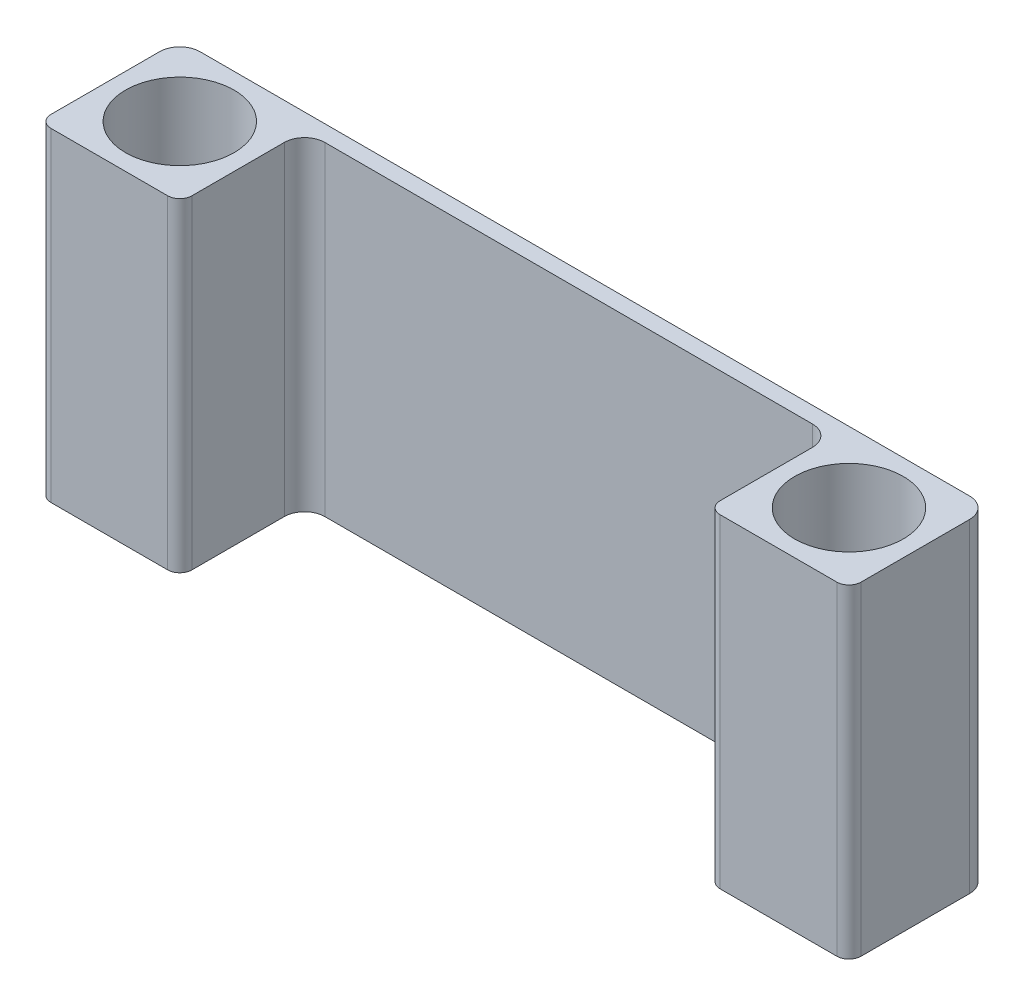
ISO-10303-21;
HEADER;
FILE_DESCRIPTION(('STEP AP214'),'2;1');
FILE_NAME('part.step','',(''),(''),'','','');
FILE_SCHEMA(('AUTOMOTIVE_DESIGN { 1 0 10303 214 1 1 1 1 }'));
ENDSEC;
DATA;
#1=APPLICATION_CONTEXT('core data for automotive mechanical design processes');
#2=APPLICATION_PROTOCOL_DEFINITION('international standard','automotive_design',2000,#1);
#3=PRODUCT_CONTEXT('',#1,'mechanical');
#4=PRODUCT('Part','Part','',(#3));
#5=PRODUCT_RELATED_PRODUCT_CATEGORY('part','',(#4));
#6=PRODUCT_DEFINITION_FORMATION('','',#4);
#7=PRODUCT_DEFINITION_CONTEXT('part definition',#1,'design');
#8=PRODUCT_DEFINITION('design','',#6,#7);
#9=PRODUCT_DEFINITION_SHAPE('','',#8);
#10=(LENGTH_UNIT() NAMED_UNIT(*) SI_UNIT(.MILLI.,.METRE.));
#11=(NAMED_UNIT(*) PLANE_ANGLE_UNIT() SI_UNIT($,.RADIAN.));
#12=(NAMED_UNIT(*) SI_UNIT($,.STERADIAN.) SOLID_ANGLE_UNIT());
#13=UNCERTAINTY_MEASURE_WITH_UNIT(LENGTH_MEASURE(1.E-05),#10,'distance_accuracy_value','');
#14=(GEOMETRIC_REPRESENTATION_CONTEXT(3) GLOBAL_UNCERTAINTY_ASSIGNED_CONTEXT((#13)) GLOBAL_UNIT_ASSIGNED_CONTEXT((#10,
#11,#12)) REPRESENTATION_CONTEXT('',''));
#15=CARTESIAN_POINT('',(0.,0.,0.));
#16=DIRECTION('',(0.,0.,1.));
#17=DIRECTION('',(1.,0.,0.));
#18=AXIS2_PLACEMENT_3D('',#15,#16,#17);
#19=CARTESIAN_POINT('',(0.,80.,-17.4));
#20=DIRECTION('',(0.,0.,-1.));
#21=DIRECTION('',(-1.,0.,0.));
#22=AXIS2_PLACEMENT_3D('',#19,#20,#21);
#23=PLANE('',#22);
#24=DIRECTION('',(1.,0.,0.));
#25=VECTOR('',#24,1.);
#26=CARTESIAN_POINT('',(0.,80.,-17.4));
#27=LINE('',#26,#25);
#28=CARTESIAN_POINT('',(-12.4,80.,-17.4));
#29=VERTEX_POINT('',#28);
#30=CARTESIAN_POINT('',(177.6,80.,-17.4));
#31=VERTEX_POINT('',#30);
#32=EDGE_CURVE('E183',#29,#31,#27,.T.);
#33=ORIENTED_EDGE('',*,*,#32,.T.);
#34=DIRECTION('',(0.,-1.,0.));
#35=VECTOR('',#34,1.);
#36=CARTESIAN_POINT('',(177.6,80.,-17.4));
#37=LINE('',#36,#35);
#38=CARTESIAN_POINT('',(177.6,0.,-17.4));
#39=VERTEX_POINT('',#38);
#40=EDGE_CURVE('E196',#31,#39,#37,.T.);
#41=ORIENTED_EDGE('',*,*,#40,.T.);
#42=DIRECTION('',(1.,0.,0.));
#43=VECTOR('',#42,1.);
#44=CARTESIAN_POINT('',(0.,0.,-17.4));
#45=LINE('',#44,#43);
#46=CARTESIAN_POINT('',(-12.4,0.,-17.4));
#47=VERTEX_POINT('',#46);
#48=EDGE_CURVE('E268',#47,#39,#45,.T.);
#49=ORIENTED_EDGE('',*,*,#48,.F.);
#50=DIRECTION('',(0.,-1.,0.));
#51=VECTOR('',#50,1.);
#52=CARTESIAN_POINT('',(-12.4,80.,-17.4));
#53=LINE('',#52,#51);
#54=EDGE_CURVE('E194',#47,#29,#53,.F.);
#55=ORIENTED_EDGE('',*,*,#54,.T.);
#56=EDGE_LOOP('',(#33,#41,#49,#55));
#57=FACE_BOUND('',#56,.T.);
#58=ADVANCED_FACE('F35',(#57),#23,.T.);
#59=CARTESIAN_POINT('',(-17.4,80.,0.));
#60=DIRECTION('',(1.,0.,0.));
#61=DIRECTION('',(0.,0.,-1.));
#62=AXIS2_PLACEMENT_3D('',#59,#60,#61);
#63=PLANE('',#62);
#64=DIRECTION('',(0.,0.,1.));
#65=VECTOR('',#64,1.);
#66=CARTESIAN_POINT('',(-17.4,0.,0.));
#67=LINE('',#66,#65);
#68=CARTESIAN_POINT('',(-17.4,0.,-12.4));
#69=VERTEX_POINT('',#68);
#70=CARTESIAN_POINT('',(-17.4,0.,14.4));
#71=VERTEX_POINT('',#70);
#72=EDGE_CURVE('E267',#69,#71,#67,.T.);
#73=ORIENTED_EDGE('',*,*,#72,.T.);
#74=DIRECTION('',(0.,-1.,0.));
#75=VECTOR('',#74,1.);
#76=CARTESIAN_POINT('',(-17.4,80.,14.4));
#77=LINE('',#76,#75);
#78=CARTESIAN_POINT('',(-17.4,80.,14.4));
#79=VERTEX_POINT('',#78);
#80=EDGE_CURVE('E11',#71,#79,#77,.F.);
#81=ORIENTED_EDGE('',*,*,#80,.T.);
#82=DIRECTION('',(0.,0.,1.));
#83=VECTOR('',#82,1.);
#84=CARTESIAN_POINT('',(-17.4,80.,0.));
#85=LINE('',#84,#83);
#86=CARTESIAN_POINT('',(-17.4,80.,-12.4));
#87=VERTEX_POINT('',#86);
#88=EDGE_CURVE('E259',#87,#79,#85,.T.);
#89=ORIENTED_EDGE('',*,*,#88,.F.);
#90=DIRECTION('',(0.,-1.,0.));
#91=VECTOR('',#90,1.);
#92=CARTESIAN_POINT('',(-17.4,0.,-12.4));
#93=LINE('',#92,#91);
#94=EDGE_CURVE('E162',#87,#69,#93,.T.);
#95=ORIENTED_EDGE('',*,*,#94,.T.);
#96=EDGE_LOOP('',(#73,#81,#89,#95));
#97=FACE_BOUND('',#96,.T.);
#98=ADVANCED_FACE('F323',(#97),#63,.F.);
#99=CARTESIAN_POINT('',(0.,80.,17.4));
#100=DIRECTION('',(0.,0.,-1.));
#101=DIRECTION('',(-1.,0.,0.));
#102=AXIS2_PLACEMENT_3D('',#99,#100,#101);
#103=PLANE('',#102);
#104=DIRECTION('',(1.,0.,0.));
#105=VECTOR('',#104,1.);
#106=CARTESIAN_POINT('',(0.,0.,17.4));
#107=LINE('',#106,#105);
#108=CARTESIAN_POINT('',(-14.4,0.,17.4));
#109=VERTEX_POINT('',#108);
#110=CARTESIAN_POINT('',(14.4,0.,17.4));
#111=VERTEX_POINT('',#110);
#112=EDGE_CURVE('E185',#109,#111,#107,.T.);
#113=ORIENTED_EDGE('',*,*,#112,.T.);
#114=DIRECTION('',(0.,-1.,0.));
#115=VECTOR('',#114,1.);
#116=CARTESIAN_POINT('',(14.4,80.,17.4));
#117=LINE('',#116,#115);
#118=CARTESIAN_POINT('',(14.4,80.,17.4));
#119=VERTEX_POINT('',#118);
#120=EDGE_CURVE('E43',#111,#119,#117,.F.);
#121=ORIENTED_EDGE('',*,*,#120,.T.);
#122=DIRECTION('',(1.,0.,0.));
#123=VECTOR('',#122,1.);
#124=CARTESIAN_POINT('',(0.,80.,17.4));
#125=LINE('',#124,#123);
#126=CARTESIAN_POINT('',(-14.4,80.,17.4));
#127=VERTEX_POINT('',#126);
#128=EDGE_CURVE('E249',#127,#119,#125,.T.);
#129=ORIENTED_EDGE('',*,*,#128,.F.);
#130=DIRECTION('',(0.,-1.,0.));
#131=VECTOR('',#130,1.);
#132=CARTESIAN_POINT('',(-14.4,80.,17.4));
#133=LINE('',#132,#131);
#134=EDGE_CURVE('E242',#127,#109,#133,.T.);
#135=ORIENTED_EDGE('',*,*,#134,.T.);
#136=EDGE_LOOP('',(#113,#121,#129,#135));
#137=FACE_BOUND('',#136,.T.);
#138=ADVANCED_FACE('F248',(#137),#103,.F.);
#139=CARTESIAN_POINT('',(17.4,80.,0.));
#140=DIRECTION('',(1.,0.,0.));
#141=DIRECTION('',(0.,0.,-1.));
#142=AXIS2_PLACEMENT_3D('',#139,#140,#141);
#143=PLANE('',#142);
#144=DIRECTION('',(0.,0.,1.));
#145=VECTOR('',#144,1.);
#146=CARTESIAN_POINT('',(17.4,80.,0.));
#147=LINE('',#146,#145);
#148=CARTESIAN_POINT('',(17.4,80.,-8.39999999999998));
#149=VERTEX_POINT('',#148);
#150=CARTESIAN_POINT('',(17.4,80.,14.4));
#151=VERTEX_POINT('',#150);
#152=EDGE_CURVE('E258',#149,#151,#147,.T.);
#153=ORIENTED_EDGE('',*,*,#152,.T.);
#154=DIRECTION('',(0.,-1.,0.));
#155=VECTOR('',#154,1.);
#156=CARTESIAN_POINT('',(17.4,0.,14.4));
#157=LINE('',#156,#155);
#158=CARTESIAN_POINT('',(17.4,0.,14.4));
#159=VERTEX_POINT('',#158);
#160=EDGE_CURVE('E239',#151,#159,#157,.T.);
#161=ORIENTED_EDGE('',*,*,#160,.T.);
#162=DIRECTION('',(0.,0.,1.));
#163=VECTOR('',#162,1.);
#164=CARTESIAN_POINT('',(17.4,0.,0.));
#165=LINE('',#164,#163);
#166=CARTESIAN_POINT('',(17.4,0.,-8.39999999999998));
#167=VERTEX_POINT('',#166);
#168=EDGE_CURVE('E180',#167,#159,#165,.T.);
#169=ORIENTED_EDGE('',*,*,#168,.F.);
#170=DIRECTION('',(0.,-1.,0.));
#171=VECTOR('',#170,1.);
#172=CARTESIAN_POINT('',(17.4,80.,-8.39999999999998));
#173=LINE('',#172,#171);
#174=EDGE_CURVE('E156',#167,#149,#173,.F.);
#175=ORIENTED_EDGE('',*,*,#174,.T.);
#176=EDGE_LOOP('',(#153,#161,#169,#175));
#177=FACE_BOUND('',#176,.T.);
#178=ADVANCED_FACE('F264',(#177),#143,.T.);
#179=CARTESIAN_POINT('',(0.,80.,0.));
#180=DIRECTION('',(0.,-1.,0.));
#181=DIRECTION('',(0.,0.,-1.));
#182=AXIS2_PLACEMENT_3D('',#179,#180,#181);
#183=CYLINDRICAL_SURFACE('',#182,13.4);
#184=CARTESIAN_POINT('',(0.,80.,0.));
#185=DIRECTION('',(0.,1.,0.));
#186=DIRECTION('',(0.,0.,1.));
#187=AXIS2_PLACEMENT_3D('',#184,#185,#186);
#188=CIRCLE('',#187,13.4);
#189=CARTESIAN_POINT('',(0.,80.,13.4));
#190=VERTEX_POINT('',#189);
#191=EDGE_CURVE('E179',#190,#190,#188,.T.);
#192=ORIENTED_EDGE('',*,*,#191,.T.);
#193=EDGE_LOOP('',(#192));
#194=FACE_BOUND('',#193,.T.);
#195=CARTESIAN_POINT('',(0.,0.,0.));
#196=DIRECTION('',(0.,1.,0.));
#197=DIRECTION('',(0.,0.,1.));
#198=AXIS2_PLACEMENT_3D('',#195,#196,#197);
#199=CIRCLE('',#198,13.4);
#200=CARTESIAN_POINT('',(0.,0.,13.4));
#201=VERTEX_POINT('',#200);
#202=EDGE_CURVE('E273',#201,#201,#199,.T.);
#203=ORIENTED_EDGE('',*,*,#202,.F.);
#204=EDGE_LOOP('',(#203));
#205=FACE_BOUND('',#204,.T.);
#206=ADVANCED_FACE('F333',(#194,#205),#183,.F.);
#207=CARTESIAN_POINT('',(0.,80.,-13.4));
#208=DIRECTION('',(0.,0.,-1.));
#209=DIRECTION('',(-1.,0.,0.));
#210=AXIS2_PLACEMENT_3D('',#207,#208,#209);
#211=PLANE('',#210);
#212=DIRECTION('',(1.,0.,0.));
#213=VECTOR('',#212,1.);
#214=CARTESIAN_POINT('',(0.,80.,-13.4));
#215=LINE('',#214,#213);
#216=CARTESIAN_POINT('',(22.4,80.,-13.4));
#217=VERTEX_POINT('',#216);
#218=CARTESIAN_POINT('',(142.8,80.,-13.4));
#219=VERTEX_POINT('',#218);
#220=EDGE_CURVE('E171',#217,#219,#215,.T.);
#221=ORIENTED_EDGE('',*,*,#220,.F.);
#222=DIRECTION('',(0.,-1.,0.));
#223=VECTOR('',#222,1.);
#224=CARTESIAN_POINT('',(22.4,80.,-13.4));
#225=LINE('',#224,#223);
#226=CARTESIAN_POINT('',(22.4,0.,-13.4));
#227=VERTEX_POINT('',#226);
#228=EDGE_CURVE('E155',#217,#227,#225,.T.);
#229=ORIENTED_EDGE('',*,*,#228,.T.);
#230=DIRECTION('',(1.,0.,0.));
#231=VECTOR('',#230,1.);
#232=CARTESIAN_POINT('',(0.,0.,-13.4));
#233=LINE('',#232,#231);
#234=CARTESIAN_POINT('',(142.8,0.,-13.4));
#235=VERTEX_POINT('',#234);
#236=EDGE_CURVE('E168',#227,#235,#233,.T.);
#237=ORIENTED_EDGE('',*,*,#236,.T.);
#238=DIRECTION('',(0.,-1.,0.));
#239=VECTOR('',#238,1.);
#240=CARTESIAN_POINT('',(142.8,80.,-13.4));
#241=LINE('',#240,#239);
#242=EDGE_CURVE('E172',#235,#219,#241,.F.);
#243=ORIENTED_EDGE('',*,*,#242,.T.);
#244=EDGE_LOOP('',(#221,#229,#237,#243));
#245=FACE_BOUND('',#244,.T.);
#246=ADVANCED_FACE('F167',(#245),#211,.F.);
#247=CARTESIAN_POINT('',(0.,80.,0.));
#248=DIRECTION('',(0.,1.,0.));
#249=DIRECTION('',(0.,0.,1.));
#250=AXIS2_PLACEMENT_3D('',#247,#248,#249);
#251=PLANE('',#250);
#252=ORIENTED_EDGE('',*,*,#191,.F.);
#253=EDGE_LOOP('',(#252));
#254=FACE_BOUND('',#253,.T.);
#255=DIRECTION('',(-1.,0.,0.));
#256=VECTOR('',#255,1.);
#257=CARTESIAN_POINT('',(165.2,80.,17.4));
#258=LINE('',#257,#256);
#259=CARTESIAN_POINT('',(179.6,80.,17.4));
#260=VERTEX_POINT('',#259);
#261=CARTESIAN_POINT('',(150.8,80.,17.4));
#262=VERTEX_POINT('',#261);
#263=EDGE_CURVE('E295',#260,#262,#258,.T.);
#264=ORIENTED_EDGE('',*,*,#263,.F.);
#265=CARTESIAN_POINT('',(179.6,80.,14.4));
#266=DIRECTION('',(0.,1.,0.));
#267=DIRECTION('',(0.,0.,1.));
#268=AXIS2_PLACEMENT_3D('',#265,#266,#267);
#269=CIRCLE('',#268,3.);
#270=CARTESIAN_POINT('',(182.6,80.,14.4));
#271=VERTEX_POINT('',#270);
#272=EDGE_CURVE('E236',#260,#271,#269,.T.);
#273=ORIENTED_EDGE('',*,*,#272,.T.);
#274=DIRECTION('',(0.,0.,1.));
#275=VECTOR('',#274,1.);
#276=CARTESIAN_POINT('',(182.6,80.,0.));
#277=LINE('',#276,#275);
#278=CARTESIAN_POINT('',(182.6,80.,-12.4));
#279=VERTEX_POINT('',#278);
#280=EDGE_CURVE('E276',#279,#271,#277,.T.);
#281=ORIENTED_EDGE('',*,*,#280,.F.);
#282=CARTESIAN_POINT('',(177.6,80.,-12.4));
#283=DIRECTION('',(0.,1.,0.));
#284=DIRECTION('',(0.,0.,1.));
#285=AXIS2_PLACEMENT_3D('',#282,#283,#284);
#286=CIRCLE('',#285,5.);
#287=EDGE_CURVE('E207',#279,#31,#286,.T.);
#288=ORIENTED_EDGE('',*,*,#287,.T.);
#289=ORIENTED_EDGE('',*,*,#32,.F.);
#290=CARTESIAN_POINT('',(-12.4,80.,-12.4));
#291=DIRECTION('',(0.,1.,0.));
#292=DIRECTION('',(0.,0.,1.));
#293=AXIS2_PLACEMENT_3D('',#290,#291,#292);
#294=CIRCLE('',#293,5.);
#295=EDGE_CURVE('E205',#29,#87,#294,.T.);
#296=ORIENTED_EDGE('',*,*,#295,.T.);
#297=ORIENTED_EDGE('',*,*,#88,.T.);
#298=CARTESIAN_POINT('',(-14.4,80.,14.4));
#299=DIRECTION('',(0.,1.,0.));
#300=DIRECTION('',(0.,0.,1.));
#301=AXIS2_PLACEMENT_3D('',#298,#299,#300);
#302=CIRCLE('',#301,3.);
#303=EDGE_CURVE('E231',#79,#127,#302,.T.);
#304=ORIENTED_EDGE('',*,*,#303,.T.);
#305=ORIENTED_EDGE('',*,*,#128,.T.);
#306=CARTESIAN_POINT('',(14.4,80.,14.4));
#307=DIRECTION('',(0.,1.,0.));
#308=DIRECTION('',(0.,0.,1.));
#309=AXIS2_PLACEMENT_3D('',#306,#307,#308);
#310=CIRCLE('',#309,3.);
#311=EDGE_CURVE('E58',#119,#151,#310,.T.);
#312=ORIENTED_EDGE('',*,*,#311,.T.);
#313=ORIENTED_EDGE('',*,*,#152,.F.);
#314=CARTESIAN_POINT('',(22.4,80.,-8.39999999999998));
#315=DIRECTION('',(0.,1.,0.));
#316=DIRECTION('',(0.,0.,1.));
#317=AXIS2_PLACEMENT_3D('',#314,#315,#316);
#318=CIRCLE('',#317,5.);
#319=EDGE_CURVE('E161',#149,#217,#318,.F.);
#320=ORIENTED_EDGE('',*,*,#319,.T.);
#321=ORIENTED_EDGE('',*,*,#220,.T.);
#322=CARTESIAN_POINT('',(142.8,80.,-8.39999999999998));
#323=DIRECTION('',(0.,1.,0.));
#324=DIRECTION('',(0.,0.,1.));
#325=AXIS2_PLACEMENT_3D('',#322,#323,#324);
#326=CIRCLE('',#325,5.);
#327=CARTESIAN_POINT('',(147.8,80.,-8.39999999999998));
#328=VERTEX_POINT('',#327);
#329=EDGE_CURVE('E213',#219,#328,#326,.F.);
#330=ORIENTED_EDGE('',*,*,#329,.T.);
#331=DIRECTION('',(0.,0.,1.));
#332=VECTOR('',#331,1.);
#333=CARTESIAN_POINT('',(147.8,80.,0.));
#334=LINE('',#333,#332);
#335=CARTESIAN_POINT('',(147.8,80.,14.4));
#336=VERTEX_POINT('',#335);
#337=EDGE_CURVE('E298',#328,#336,#334,.T.);
#338=ORIENTED_EDGE('',*,*,#337,.T.);
#339=CARTESIAN_POINT('',(150.8,80.,14.4));
#340=DIRECTION('',(0.,1.,0.));
#341=DIRECTION('',(0.,0.,1.));
#342=AXIS2_PLACEMENT_3D('',#339,#340,#341);
#343=CIRCLE('',#342,3.);
#344=EDGE_CURVE('E234',#336,#262,#343,.T.);
#345=ORIENTED_EDGE('',*,*,#344,.T.);
#346=EDGE_LOOP('',(#264,#273,#281,#288,#289,#296,#297,#304,#305,#312,#313,#320,#321,#330,#338,#345));
#347=FACE_BOUND('',#346,.T.);
#348=CARTESIAN_POINT('',(165.2,80.,0.));
#349=DIRECTION('',(0.,-1.,0.));
#350=DIRECTION('',(0.,0.,1.));
#351=AXIS2_PLACEMENT_3D('',#348,#349,#350);
#352=CIRCLE('',#351,13.4);
#353=CARTESIAN_POINT('',(165.2,80.,13.4));
#354=VERTEX_POINT('',#353);
#355=EDGE_CURVE('E284',#354,#354,#352,.T.);
#356=ORIENTED_EDGE('',*,*,#355,.T.);
#357=EDGE_LOOP('',(#356));
#358=FACE_BOUND('',#357,.T.);
#359=ADVANCED_FACE('F254',(#254,#347,#358),#251,.T.);
#360=CARTESIAN_POINT('',(0.,0.,0.));
#361=DIRECTION('',(0.,1.,0.));
#362=DIRECTION('',(0.,0.,1.));
#363=AXIS2_PLACEMENT_3D('',#360,#361,#362);
#364=PLANE('',#363);
#365=ORIENTED_EDGE('',*,*,#202,.T.);
#366=EDGE_LOOP('',(#365));
#367=FACE_BOUND('',#366,.T.);
#368=DIRECTION('',(0.,0.,1.));
#369=VECTOR('',#368,1.);
#370=CARTESIAN_POINT('',(182.6,0.,0.));
#371=LINE('',#370,#369);
#372=CARTESIAN_POINT('',(182.6,0.,-12.4));
#373=VERTEX_POINT('',#372);
#374=CARTESIAN_POINT('',(182.6,0.,14.4));
#375=VERTEX_POINT('',#374);
#376=EDGE_CURVE('E282',#373,#375,#371,.T.);
#377=ORIENTED_EDGE('',*,*,#376,.T.);
#378=CARTESIAN_POINT('',(179.6,0.,14.4));
#379=DIRECTION('',(0.,1.,0.));
#380=DIRECTION('',(0.,0.,1.));
#381=AXIS2_PLACEMENT_3D('',#378,#379,#380);
#382=CIRCLE('',#381,3.);
#383=CARTESIAN_POINT('',(179.6,0.,17.4));
#384=VERTEX_POINT('',#383);
#385=EDGE_CURVE('E224',#375,#384,#382,.F.);
#386=ORIENTED_EDGE('',*,*,#385,.T.);
#387=DIRECTION('',(-1.,0.,0.));
#388=VECTOR('',#387,1.);
#389=CARTESIAN_POINT('',(165.2,0.,17.4));
#390=LINE('',#389,#388);
#391=CARTESIAN_POINT('',(150.8,0.,17.4));
#392=VERTEX_POINT('',#391);
#393=EDGE_CURVE('E285',#384,#392,#390,.T.);
#394=ORIENTED_EDGE('',*,*,#393,.T.);
#395=CARTESIAN_POINT('',(150.8,0.,14.4));
#396=DIRECTION('',(0.,1.,0.));
#397=DIRECTION('',(0.,0.,1.));
#398=AXIS2_PLACEMENT_3D('',#395,#396,#397);
#399=CIRCLE('',#398,3.);
#400=CARTESIAN_POINT('',(147.8,0.,14.4));
#401=VERTEX_POINT('',#400);
#402=EDGE_CURVE('E222',#392,#401,#399,.F.);
#403=ORIENTED_EDGE('',*,*,#402,.T.);
#404=DIRECTION('',(0.,0.,1.));
#405=VECTOR('',#404,1.);
#406=CARTESIAN_POINT('',(147.8,0.,0.));
#407=LINE('',#406,#405);
#408=CARTESIAN_POINT('',(147.8,0.,-8.39999999999998));
#409=VERTEX_POINT('',#408);
#410=EDGE_CURVE('E288',#409,#401,#407,.T.);
#411=ORIENTED_EDGE('',*,*,#410,.F.);
#412=CARTESIAN_POINT('',(142.8,0.,-8.39999999999998));
#413=DIRECTION('',(0.,1.,0.));
#414=DIRECTION('',(0.,0.,1.));
#415=AXIS2_PLACEMENT_3D('',#412,#413,#414);
#416=CIRCLE('',#415,5.);
#417=EDGE_CURVE('E178',#409,#235,#416,.T.);
#418=ORIENTED_EDGE('',*,*,#417,.T.);
#419=ORIENTED_EDGE('',*,*,#236,.F.);
#420=CARTESIAN_POINT('',(22.4,0.,-8.39999999999998));
#421=DIRECTION('',(0.,1.,0.));
#422=DIRECTION('',(0.,0.,1.));
#423=AXIS2_PLACEMENT_3D('',#420,#421,#422);
#424=CIRCLE('',#423,5.);
#425=EDGE_CURVE('E151',#227,#167,#424,.T.);
#426=ORIENTED_EDGE('',*,*,#425,.T.);
#427=ORIENTED_EDGE('',*,*,#168,.T.);
#428=CARTESIAN_POINT('',(14.4,0.,14.4));
#429=DIRECTION('',(0.,1.,0.));
#430=DIRECTION('',(0.,0.,1.));
#431=AXIS2_PLACEMENT_3D('',#428,#429,#430);
#432=CIRCLE('',#431,3.);
#433=EDGE_CURVE('E220',#159,#111,#432,.F.);
#434=ORIENTED_EDGE('',*,*,#433,.T.);
#435=ORIENTED_EDGE('',*,*,#112,.F.);
#436=CARTESIAN_POINT('',(-14.4,0.,14.4));
#437=DIRECTION('',(0.,1.,0.));
#438=DIRECTION('',(0.,0.,1.));
#439=AXIS2_PLACEMENT_3D('',#436,#437,#438);
#440=CIRCLE('',#439,3.);
#441=EDGE_CURVE('E218',#109,#71,#440,.F.);
#442=ORIENTED_EDGE('',*,*,#441,.T.);
#443=ORIENTED_EDGE('',*,*,#72,.F.);
#444=CARTESIAN_POINT('',(-12.4,0.,-12.4));
#445=DIRECTION('',(0.,1.,0.));
#446=DIRECTION('',(0.,0.,1.));
#447=AXIS2_PLACEMENT_3D('',#444,#445,#446);
#448=CIRCLE('',#447,5.);
#449=EDGE_CURVE('E199',#69,#47,#448,.F.);
#450=ORIENTED_EDGE('',*,*,#449,.T.);
#451=ORIENTED_EDGE('',*,*,#48,.T.);
#452=CARTESIAN_POINT('',(177.6,0.,-12.4));
#453=DIRECTION('',(0.,1.,0.));
#454=DIRECTION('',(0.,0.,1.));
#455=AXIS2_PLACEMENT_3D('',#452,#453,#454);
#456=CIRCLE('',#455,5.);
#457=EDGE_CURVE('E201',#39,#373,#456,.F.);
#458=ORIENTED_EDGE('',*,*,#457,.T.);
#459=EDGE_LOOP('',(#377,#386,#394,#403,#411,#418,#419,#426,#427,#434,#435,#442,#443,#450,#451,#458));
#460=FACE_BOUND('',#459,.T.);
#461=CARTESIAN_POINT('',(165.2,0.,0.));
#462=DIRECTION('',(0.,-1.,0.));
#463=DIRECTION('',(0.,0.,1.));
#464=AXIS2_PLACEMENT_3D('',#461,#462,#463);
#465=CIRCLE('',#464,13.4);
#466=CARTESIAN_POINT('',(165.2,0.,13.4));
#467=VERTEX_POINT('',#466);
#468=EDGE_CURVE('E290',#467,#467,#465,.T.);
#469=ORIENTED_EDGE('',*,*,#468,.F.);
#470=EDGE_LOOP('',(#469));
#471=FACE_BOUND('',#470,.T.);
#472=ADVANCED_FACE('F175',(#367,#460,#471),#364,.F.);
#473=CARTESIAN_POINT('',(147.8,80.,0.));
#474=DIRECTION('',(1.,0.,0.));
#475=DIRECTION('',(0.,0.,-1.));
#476=AXIS2_PLACEMENT_3D('',#473,#474,#475);
#477=PLANE('',#476);
#478=ORIENTED_EDGE('',*,*,#410,.T.);
#479=DIRECTION('',(0.,-1.,0.));
#480=VECTOR('',#479,1.);
#481=CARTESIAN_POINT('',(147.8,80.,14.4));
#482=LINE('',#481,#480);
#483=EDGE_CURVE('E50',#401,#336,#482,.F.);
#484=ORIENTED_EDGE('',*,*,#483,.T.);
#485=ORIENTED_EDGE('',*,*,#337,.F.);
#486=DIRECTION('',(0.,-1.,0.));
#487=VECTOR('',#486,1.);
#488=CARTESIAN_POINT('',(147.8,0.,-8.39999999999998));
#489=LINE('',#488,#487);
#490=EDGE_CURVE('E191',#328,#409,#489,.T.);
#491=ORIENTED_EDGE('',*,*,#490,.T.);
#492=EDGE_LOOP('',(#478,#484,#485,#491));
#493=FACE_BOUND('',#492,.T.);
#494=ADVANCED_FACE('F310',(#493),#477,.F.);
#495=CARTESIAN_POINT('',(165.2,80.,17.4));
#496=DIRECTION('',(0.,0.,1.));
#497=DIRECTION('',(1.,0.,0.));
#498=AXIS2_PLACEMENT_3D('',#495,#496,#497);
#499=PLANE('',#498);
#500=ORIENTED_EDGE('',*,*,#393,.F.);
#501=DIRECTION('',(0.,-1.,0.));
#502=VECTOR('',#501,1.);
#503=CARTESIAN_POINT('',(179.6,80.,17.4));
#504=LINE('',#503,#502);
#505=EDGE_CURVE('E229',#384,#260,#504,.F.);
#506=ORIENTED_EDGE('',*,*,#505,.T.);
#507=ORIENTED_EDGE('',*,*,#263,.T.);
#508=DIRECTION('',(0.,-1.,0.));
#509=VECTOR('',#508,1.);
#510=CARTESIAN_POINT('',(150.8,0.,17.4));
#511=LINE('',#510,#509);
#512=EDGE_CURVE('E226',#262,#392,#511,.T.);
#513=ORIENTED_EDGE('',*,*,#512,.T.);
#514=EDGE_LOOP('',(#500,#506,#507,#513));
#515=FACE_BOUND('',#514,.T.);
#516=ADVANCED_FACE('F317',(#515),#499,.T.);
#517=CARTESIAN_POINT('',(182.6,80.,0.));
#518=DIRECTION('',(1.,0.,0.));
#519=DIRECTION('',(0.,0.,-1.));
#520=AXIS2_PLACEMENT_3D('',#517,#518,#519);
#521=PLANE('',#520);
#522=ORIENTED_EDGE('',*,*,#280,.T.);
#523=DIRECTION('',(0.,-1.,0.));
#524=VECTOR('',#523,1.);
#525=CARTESIAN_POINT('',(182.6,80.,14.4));
#526=LINE('',#525,#524);
#527=EDGE_CURVE('E215',#271,#375,#526,.T.);
#528=ORIENTED_EDGE('',*,*,#527,.T.);
#529=ORIENTED_EDGE('',*,*,#376,.F.);
#530=DIRECTION('',(0.,-1.,0.));
#531=VECTOR('',#530,1.);
#532=CARTESIAN_POINT('',(182.6,80.,-12.4));
#533=LINE('',#532,#531);
#534=EDGE_CURVE('E203',#373,#279,#533,.F.);
#535=ORIENTED_EDGE('',*,*,#534,.T.);
#536=EDGE_LOOP('',(#522,#528,#529,#535));
#537=FACE_BOUND('',#536,.T.);
#538=ADVANCED_FACE('F306',(#537),#521,.T.);
#539=CARTESIAN_POINT('',(165.2,80.,0.));
#540=DIRECTION('',(0.,-1.,0.));
#541=DIRECTION('',(0.,0.,-1.));
#542=AXIS2_PLACEMENT_3D('',#539,#540,#541);
#543=CYLINDRICAL_SURFACE('',#542,13.4);
#544=ORIENTED_EDGE('',*,*,#355,.F.);
#545=EDGE_LOOP('',(#544));
#546=FACE_BOUND('',#545,.T.);
#547=ORIENTED_EDGE('',*,*,#468,.T.);
#548=EDGE_LOOP('',(#547));
#549=FACE_BOUND('',#548,.T.);
#550=ADVANCED_FACE('F303',(#546,#549),#543,.F.);
#551=CARTESIAN_POINT('',(22.4,80.,-8.39999999999998));
#552=DIRECTION('',(0.,-1.,0.));
#553=DIRECTION('',(0.,0.,-1.));
#554=AXIS2_PLACEMENT_3D('',#551,#552,#553);
#555=CYLINDRICAL_SURFACE('',#554,5.);
#556=ORIENTED_EDGE('',*,*,#319,.F.);
#557=ORIENTED_EDGE('',*,*,#174,.F.);
#558=ORIENTED_EDGE('',*,*,#425,.F.);
#559=ORIENTED_EDGE('',*,*,#228,.F.);
#560=EDGE_LOOP('',(#556,#557,#558,#559));
#561=FACE_BOUND('',#560,.T.);
#562=ADVANCED_FACE('F154',(#561),#555,.F.);
#563=CARTESIAN_POINT('',(142.8,80.,-8.39999999999998));
#564=DIRECTION('',(0.,1.,0.));
#565=DIRECTION('',(0.,0.,1.));
#566=AXIS2_PLACEMENT_3D('',#563,#564,#565);
#567=CYLINDRICAL_SURFACE('',#566,5.);
#568=ORIENTED_EDGE('',*,*,#329,.F.);
#569=ORIENTED_EDGE('',*,*,#242,.F.);
#570=ORIENTED_EDGE('',*,*,#417,.F.);
#571=ORIENTED_EDGE('',*,*,#490,.F.);
#572=EDGE_LOOP('',(#568,#569,#570,#571));
#573=FACE_BOUND('',#572,.T.);
#574=ADVANCED_FACE('F339',(#573),#567,.F.);
#575=CARTESIAN_POINT('',(177.6,80.,-12.4));
#576=DIRECTION('',(0.,-1.,0.));
#577=DIRECTION('',(0.,0.,-1.));
#578=AXIS2_PLACEMENT_3D('',#575,#576,#577);
#579=CYLINDRICAL_SURFACE('',#578,5.);
#580=ORIENTED_EDGE('',*,*,#287,.F.);
#581=ORIENTED_EDGE('',*,*,#534,.F.);
#582=ORIENTED_EDGE('',*,*,#457,.F.);
#583=ORIENTED_EDGE('',*,*,#40,.F.);
#584=EDGE_LOOP('',(#580,#581,#582,#583));
#585=FACE_BOUND('',#584,.T.);
#586=ADVANCED_FACE('F342',(#585),#579,.T.);
#587=CARTESIAN_POINT('',(-12.4,80.,-12.4));
#588=DIRECTION('',(0.,1.,0.));
#589=DIRECTION('',(0.,0.,1.));
#590=AXIS2_PLACEMENT_3D('',#587,#588,#589);
#591=CYLINDRICAL_SURFACE('',#590,5.);
#592=ORIENTED_EDGE('',*,*,#295,.F.);
#593=ORIENTED_EDGE('',*,*,#54,.F.);
#594=ORIENTED_EDGE('',*,*,#449,.F.);
#595=ORIENTED_EDGE('',*,*,#94,.F.);
#596=EDGE_LOOP('',(#592,#593,#594,#595));
#597=FACE_BOUND('',#596,.T.);
#598=ADVANCED_FACE('F346',(#597),#591,.T.);
#599=CARTESIAN_POINT('',(179.6,80.,14.4));
#600=DIRECTION('',(0.,-1.,0.));
#601=DIRECTION('',(0.,0.,-1.));
#602=AXIS2_PLACEMENT_3D('',#599,#600,#601);
#603=CYLINDRICAL_SURFACE('',#602,3.);
#604=ORIENTED_EDGE('',*,*,#272,.F.);
#605=ORIENTED_EDGE('',*,*,#505,.F.);
#606=ORIENTED_EDGE('',*,*,#385,.F.);
#607=ORIENTED_EDGE('',*,*,#527,.F.);
#608=EDGE_LOOP('',(#604,#605,#606,#607));
#609=FACE_BOUND('',#608,.T.);
#610=ADVANCED_FACE('F350',(#609),#603,.T.);
#611=CARTESIAN_POINT('',(150.8,80.,14.4));
#612=DIRECTION('',(0.,1.,0.));
#613=DIRECTION('',(0.,0.,1.));
#614=AXIS2_PLACEMENT_3D('',#611,#612,#613);
#615=CYLINDRICAL_SURFACE('',#614,3.);
#616=ORIENTED_EDGE('',*,*,#344,.F.);
#617=ORIENTED_EDGE('',*,*,#483,.F.);
#618=ORIENTED_EDGE('',*,*,#402,.F.);
#619=ORIENTED_EDGE('',*,*,#512,.F.);
#620=EDGE_LOOP('',(#616,#617,#618,#619));
#621=FACE_BOUND('',#620,.T.);
#622=ADVANCED_FACE('F354',(#621),#615,.T.);
#623=CARTESIAN_POINT('',(14.4,80.,14.4));
#624=DIRECTION('',(0.,1.,0.));
#625=DIRECTION('',(0.,0.,1.));
#626=AXIS2_PLACEMENT_3D('',#623,#624,#625);
#627=CYLINDRICAL_SURFACE('',#626,3.);
#628=ORIENTED_EDGE('',*,*,#311,.F.);
#629=ORIENTED_EDGE('',*,*,#120,.F.);
#630=ORIENTED_EDGE('',*,*,#433,.F.);
#631=ORIENTED_EDGE('',*,*,#160,.F.);
#632=EDGE_LOOP('',(#628,#629,#630,#631));
#633=FACE_BOUND('',#632,.T.);
#634=ADVANCED_FACE('F262',(#633),#627,.T.);
#635=CARTESIAN_POINT('',(-14.4,80.,14.4));
#636=DIRECTION('',(0.,-1.,0.));
#637=DIRECTION('',(0.,0.,-1.));
#638=AXIS2_PLACEMENT_3D('',#635,#636,#637);
#639=CYLINDRICAL_SURFACE('',#638,3.);
#640=ORIENTED_EDGE('',*,*,#303,.F.);
#641=ORIENTED_EDGE('',*,*,#80,.F.);
#642=ORIENTED_EDGE('',*,*,#441,.F.);
#643=ORIENTED_EDGE('',*,*,#134,.F.);
#644=EDGE_LOOP('',(#640,#641,#642,#643));
#645=FACE_BOUND('',#644,.T.);
#646=ADVANCED_FACE('F37',(#645),#639,.T.);
#647=CLOSED_SHELL('',(#58,#98,#138,#178,#206,#246,#359,#472,#494,#516,#538,#550,#562,#574,#586,
#598,#610,#622,#634,#646));
#648=MANIFOLD_SOLID_BREP('B2',#647);
#649=ADVANCED_BREP_SHAPE_REPRESENTATION('',(#18,#648),#14);
#650=SHAPE_DEFINITION_REPRESENTATION(#9,#649);
ENDSEC;
END-ISO-10303-21;
